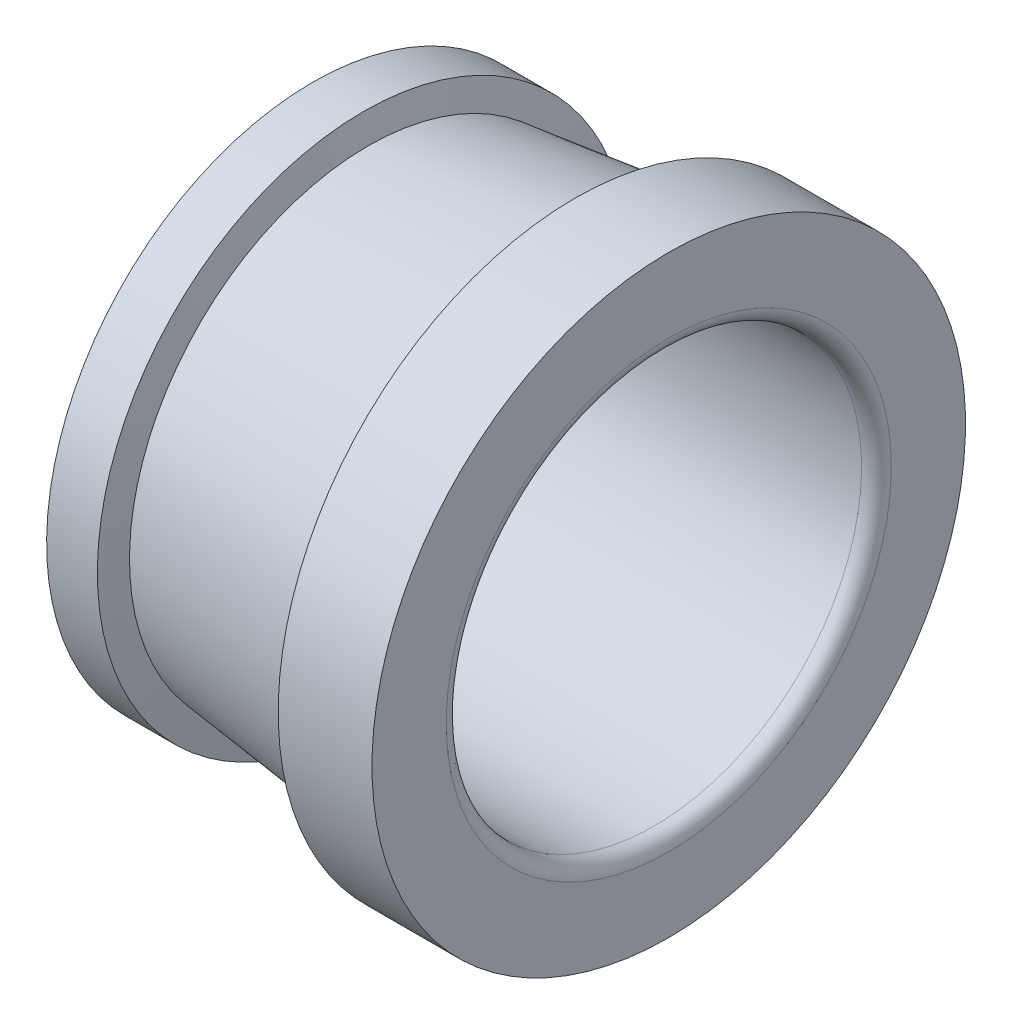
ISO-10303-21;
HEADER;
FILE_DESCRIPTION(('STEP AP214'),'2;1');
FILE_NAME('part.step','',(''),(''),'','','');
FILE_SCHEMA(('AUTOMOTIVE_DESIGN { 1 0 10303 214 1 1 1 1 }'));
ENDSEC;
DATA;
#1=APPLICATION_CONTEXT('core data for automotive mechanical design processes');
#2=APPLICATION_PROTOCOL_DEFINITION('international standard','automotive_design',2000,#1);
#3=PRODUCT_CONTEXT('',#1,'mechanical');
#4=PRODUCT('Part','Part','',(#3));
#5=PRODUCT_RELATED_PRODUCT_CATEGORY('part','',(#4));
#6=PRODUCT_DEFINITION_FORMATION('','',#4);
#7=PRODUCT_DEFINITION_CONTEXT('part definition',#1,'design');
#8=PRODUCT_DEFINITION('design','',#6,#7);
#9=PRODUCT_DEFINITION_SHAPE('','',#8);
#10=(LENGTH_UNIT() NAMED_UNIT(*) SI_UNIT(.MILLI.,.METRE.));
#11=(NAMED_UNIT(*) PLANE_ANGLE_UNIT() SI_UNIT($,.RADIAN.));
#12=(NAMED_UNIT(*) SI_UNIT($,.STERADIAN.) SOLID_ANGLE_UNIT());
#13=UNCERTAINTY_MEASURE_WITH_UNIT(LENGTH_MEASURE(1.E-05),#10,'distance_accuracy_value','');
#14=(GEOMETRIC_REPRESENTATION_CONTEXT(3) GLOBAL_UNCERTAINTY_ASSIGNED_CONTEXT((#13)) GLOBAL_UNIT_ASSIGNED_CONTEXT((#10,
#11,#12)) REPRESENTATION_CONTEXT('',''));
#15=CARTESIAN_POINT('',(0.,0.,0.));
#16=DIRECTION('',(0.,0.,1.));
#17=DIRECTION('',(1.,0.,0.));
#18=AXIS2_PLACEMENT_3D('',#15,#16,#17);
#19=CARTESIAN_POINT('',(23.,0.,0.));
#20=DIRECTION('',(1.,0.,0.));
#21=DIRECTION('',(0.,1.,0.));
#22=AXIS2_PLACEMENT_3D('',#19,#20,#21);
#23=TOROIDAL_SURFACE('',#22,15.,1.);
#24=CARTESIAN_POINT('',(24.,0.,0.));
#25=DIRECTION('',(1.,0.,0.));
#26=DIRECTION('',(0.,1.,0.));
#27=AXIS2_PLACEMENT_3D('',#24,#25,#26);
#28=CIRCLE('',#27,15.);
#29=CARTESIAN_POINT('',(24.,15.,0.));
#30=VERTEX_POINT('',#29);
#31=EDGE_CURVE('E11',#30,#30,#28,.T.);
#32=ORIENTED_EDGE('',*,*,#31,.T.);
#33=EDGE_LOOP('',(#32));
#34=FACE_BOUND('',#33,.T.);
#35=CARTESIAN_POINT('',(23.,0.,0.));
#36=DIRECTION('',(1.,0.,0.));
#37=DIRECTION('',(0.,1.,0.));
#38=AXIS2_PLACEMENT_3D('',#35,#36,#37);
#39=CIRCLE('',#38,14.);
#40=CARTESIAN_POINT('',(23.,14.,0.));
#41=VERTEX_POINT('',#40);
#42=EDGE_CURVE('E26',#41,#41,#39,.T.);
#43=ORIENTED_EDGE('',*,*,#42,.F.);
#44=EDGE_LOOP('',(#43));
#45=FACE_BOUND('',#44,.T.);
#46=ADVANCED_FACE('F17',(#34,#45),#23,.T.);
#47=CARTESIAN_POINT('',(1.,0.,0.));
#48=DIRECTION('',(1.,0.,0.));
#49=DIRECTION('',(0.,1.,0.));
#50=AXIS2_PLACEMENT_3D('',#47,#48,#49);
#51=TOROIDAL_SURFACE('',#50,15.,1.);
#52=CARTESIAN_POINT('',(1.,0.,0.));
#53=DIRECTION('',(1.,0.,0.));
#54=DIRECTION('',(0.,1.,0.));
#55=AXIS2_PLACEMENT_3D('',#52,#53,#54);
#56=CIRCLE('',#55,14.);
#57=CARTESIAN_POINT('',(1.,14.,0.));
#58=VERTEX_POINT('',#57);
#59=EDGE_CURVE('E20',#58,#58,#56,.T.);
#60=ORIENTED_EDGE('',*,*,#59,.T.);
#61=EDGE_LOOP('',(#60));
#62=FACE_BOUND('',#61,.T.);
#63=CARTESIAN_POINT('',(0.,0.,0.));
#64=DIRECTION('',(1.,0.,0.));
#65=DIRECTION('',(0.,1.,0.));
#66=AXIS2_PLACEMENT_3D('',#63,#64,#65);
#67=CIRCLE('',#66,15.);
#68=CARTESIAN_POINT('',(0.,15.,0.));
#69=VERTEX_POINT('',#68);
#70=EDGE_CURVE('E100',#69,#69,#67,.T.);
#71=ORIENTED_EDGE('',*,*,#70,.F.);
#72=EDGE_LOOP('',(#71));
#73=FACE_BOUND('',#72,.T.);
#74=ADVANCED_FACE('F109',(#62,#73),#51,.T.);
#75=CARTESIAN_POINT('',(24.,0.,0.));
#76=DIRECTION('',(1.,0.,0.));
#77=DIRECTION('',(0.,1.,0.));
#78=AXIS2_PLACEMENT_3D('',#75,#76,#77);
#79=PLANE('',#78);
#80=ORIENTED_EDGE('',*,*,#31,.F.);
#81=EDGE_LOOP('',(#80));
#82=FACE_BOUND('',#81,.T.);
#83=CARTESIAN_POINT('',(24.,0.,0.));
#84=DIRECTION('',(1.,0.,0.));
#85=DIRECTION('',(0.,1.,0.));
#86=AXIS2_PLACEMENT_3D('',#83,#84,#85);
#87=CIRCLE('',#86,20.0044225453696);
#88=CARTESIAN_POINT('',(24.,20.0044225453696,0.));
#89=VERTEX_POINT('',#88);
#90=EDGE_CURVE('E80',#89,#89,#87,.T.);
#91=ORIENTED_EDGE('',*,*,#90,.T.);
#92=EDGE_LOOP('',(#91));
#93=FACE_BOUND('',#92,.T.);
#94=ADVANCED_FACE('F115',(#82,#93),#79,.T.);
#95=CARTESIAN_POINT('',(24.,0.,0.));
#96=DIRECTION('',(1.,0.,0.));
#97=DIRECTION('',(0.,1.,0.));
#98=AXIS2_PLACEMENT_3D('',#95,#96,#97);
#99=CYLINDRICAL_SURFACE('',#98,14.);
#100=ORIENTED_EDGE('',*,*,#42,.T.);
#101=EDGE_LOOP('',(#100));
#102=FACE_BOUND('',#101,.T.);
#103=ORIENTED_EDGE('',*,*,#59,.F.);
#104=EDGE_LOOP('',(#103));
#105=FACE_BOUND('',#104,.T.);
#106=ADVANCED_FACE('F112',(#102,#105),#99,.F.);
#107=CARTESIAN_POINT('',(0.,0.,0.));
#108=DIRECTION('',(-1.,0.,0.));
#109=DIRECTION('',(0.,0.,1.));
#110=AXIS2_PLACEMENT_3D('',#107,#108,#109);
#111=PLANE('',#110);
#112=ORIENTED_EDGE('',*,*,#70,.T.);
#113=EDGE_LOOP('',(#112));
#114=FACE_BOUND('',#113,.T.);
#115=CARTESIAN_POINT('',(0.,0.,0.));
#116=DIRECTION('',(1.,0.,0.));
#117=DIRECTION('',(0.,1.,0.));
#118=AXIS2_PLACEMENT_3D('',#115,#116,#117);
#119=CIRCLE('',#118,17.9376754817258);
#120=CARTESIAN_POINT('',(0.,17.9376754817258,0.));
#121=VERTEX_POINT('',#120);
#122=EDGE_CURVE('E98',#121,#121,#119,.T.);
#123=ORIENTED_EDGE('',*,*,#122,.F.);
#124=EDGE_LOOP('',(#123));
#125=FACE_BOUND('',#124,.T.);
#126=ADVANCED_FACE('F114',(#114,#125),#111,.T.);
#127=CARTESIAN_POINT('',(0.,0.,0.));
#128=DIRECTION('',(1.,0.,0.));
#129=DIRECTION('',(0.,1.,0.));
#130=AXIS2_PLACEMENT_3D('',#127,#128,#129);
#131=CYLINDRICAL_SURFACE('',#130,17.9376754817258);
#132=CARTESIAN_POINT('',(3.42048900015241,0.,0.));
#133=DIRECTION('',(1.,0.,0.));
#134=DIRECTION('',(0.,1.,0.));
#135=AXIS2_PLACEMENT_3D('',#132,#133,#134);
#136=CIRCLE('',#135,17.9376754817258);
#137=CARTESIAN_POINT('',(3.42048900015241,17.9376754817258,0.));
#138=VERTEX_POINT('',#137);
#139=EDGE_CURVE('E93',#138,#138,#136,.T.);
#140=ORIENTED_EDGE('',*,*,#139,.F.);
#141=EDGE_LOOP('',(#140));
#142=FACE_BOUND('',#141,.T.);
#143=ORIENTED_EDGE('',*,*,#122,.T.);
#144=EDGE_LOOP('',(#143));
#145=FACE_BOUND('',#144,.T.);
#146=ADVANCED_FACE('F122',(#142,#145),#131,.T.);
#147=CARTESIAN_POINT('',(3.57925416001087,0.,0.));
#148=DIRECTION('',(-1.,0.,0.));
#149=DIRECTION('',(0.,-1.,0.));
#150=AXIS2_PLACEMENT_3D('',#147,#148,#149);
#151=CONICAL_SURFACE('',#150,17.0137166763588,1.40062672472545);
#152=CARTESIAN_POINT('',(3.73801931986933,0.,0.));
#153=DIRECTION('',(1.,0.,0.));
#154=DIRECTION('',(0.,1.,0.));
#155=AXIS2_PLACEMENT_3D('',#152,#153,#154);
#156=CIRCLE('',#155,16.0897578709919);
#157=CARTESIAN_POINT('',(3.73801931986933,16.0897578709919,0.));
#158=VERTEX_POINT('',#157);
#159=EDGE_CURVE('E90',#158,#158,#156,.T.);
#160=ORIENTED_EDGE('',*,*,#159,.F.);
#161=EDGE_LOOP('',(#160));
#162=FACE_BOUND('',#161,.T.);
#163=ORIENTED_EDGE('',*,*,#139,.T.);
#164=EDGE_LOOP('',(#163));
#165=FACE_BOUND('',#164,.T.);
#166=ADVANCED_FACE('F137',(#162,#165),#151,.T.);
#167=CARTESIAN_POINT('',(10.8979246113072,0.,0.));
#168=DIRECTION('',(1.,0.,0.));
#169=DIRECTION('',(0.,1.,0.));
#170=AXIS2_PLACEMENT_3D('',#167,#168,#169);
#171=CONICAL_SURFACE('',#170,16.9371885069227,0.117809724509617);
#172=CARTESIAN_POINT('',(18.0578299027451,0.,0.));
#173=DIRECTION('',(1.,0.,0.));
#174=DIRECTION('',(0.,1.,0.));
#175=AXIS2_PLACEMENT_3D('',#172,#173,#174);
#176=CIRCLE('',#175,17.7846191428536);
#177=CARTESIAN_POINT('',(18.0578299027451,17.7846191428536,0.));
#178=VERTEX_POINT('',#177);
#179=EDGE_CURVE('E85',#178,#178,#176,.T.);
#180=ORIENTED_EDGE('',*,*,#179,.F.);
#181=EDGE_LOOP('',(#180));
#182=FACE_BOUND('',#181,.T.);
#183=ORIENTED_EDGE('',*,*,#159,.T.);
#184=EDGE_LOOP('',(#183));
#185=FACE_BOUND('',#184,.T.);
#186=ADVANCED_FACE('F141',(#182,#185),#171,.T.);
#187=CARTESIAN_POINT('',(17.8671139097768,0.,0.));
#188=DIRECTION('',(-1.,0.,0.));
#189=DIRECTION('',(0.,-1.,0.));
#190=AXIS2_PLACEMENT_3D('',#187,#188,#189);
#191=CONICAL_SURFACE('',#190,18.8945208441116,1.40062672472545);
#192=ORIENTED_EDGE('',*,*,#179,.T.);
#193=EDGE_LOOP('',(#192));
#194=FACE_BOUND('',#193,.T.);
#195=CARTESIAN_POINT('',(17.6763979168084,0.,0.));
#196=DIRECTION('',(1.,0.,0.));
#197=DIRECTION('',(0.,1.,0.));
#198=AXIS2_PLACEMENT_3D('',#195,#196,#197);
#199=CIRCLE('',#198,20.0044225453696);
#200=CARTESIAN_POINT('',(17.6763979168084,20.0044225453696,0.));
#201=VERTEX_POINT('',#200);
#202=EDGE_CURVE('E76',#201,#201,#199,.T.);
#203=ORIENTED_EDGE('',*,*,#202,.F.);
#204=EDGE_LOOP('',(#203));
#205=FACE_BOUND('',#204,.T.);
#206=ADVANCED_FACE('F145',(#194,#205),#191,.F.);
#207=CARTESIAN_POINT('',(17.6763979168084,0.,0.));
#208=DIRECTION('',(1.,0.,0.));
#209=DIRECTION('',(0.,1.,0.));
#210=AXIS2_PLACEMENT_3D('',#207,#208,#209);
#211=CYLINDRICAL_SURFACE('',#210,20.0044225453696);
#212=ORIENTED_EDGE('',*,*,#90,.F.);
#213=EDGE_LOOP('',(#212));
#214=FACE_BOUND('',#213,.T.);
#215=ORIENTED_EDGE('',*,*,#202,.T.);
#216=EDGE_LOOP('',(#215));
#217=FACE_BOUND('',#216,.T.);
#218=ADVANCED_FACE('F77',(#214,#217),#211,.T.);
#219=CLOSED_SHELL('',(#46,#74,#94,#106,#126,#146,#166,#186,#206,#218));
#220=MANIFOLD_SOLID_BREP('B1',#219);
#221=ADVANCED_BREP_SHAPE_REPRESENTATION('',(#18,#220),#14);
#222=SHAPE_DEFINITION_REPRESENTATION(#9,#221);
ENDSEC;
END-ISO-10303-21;
